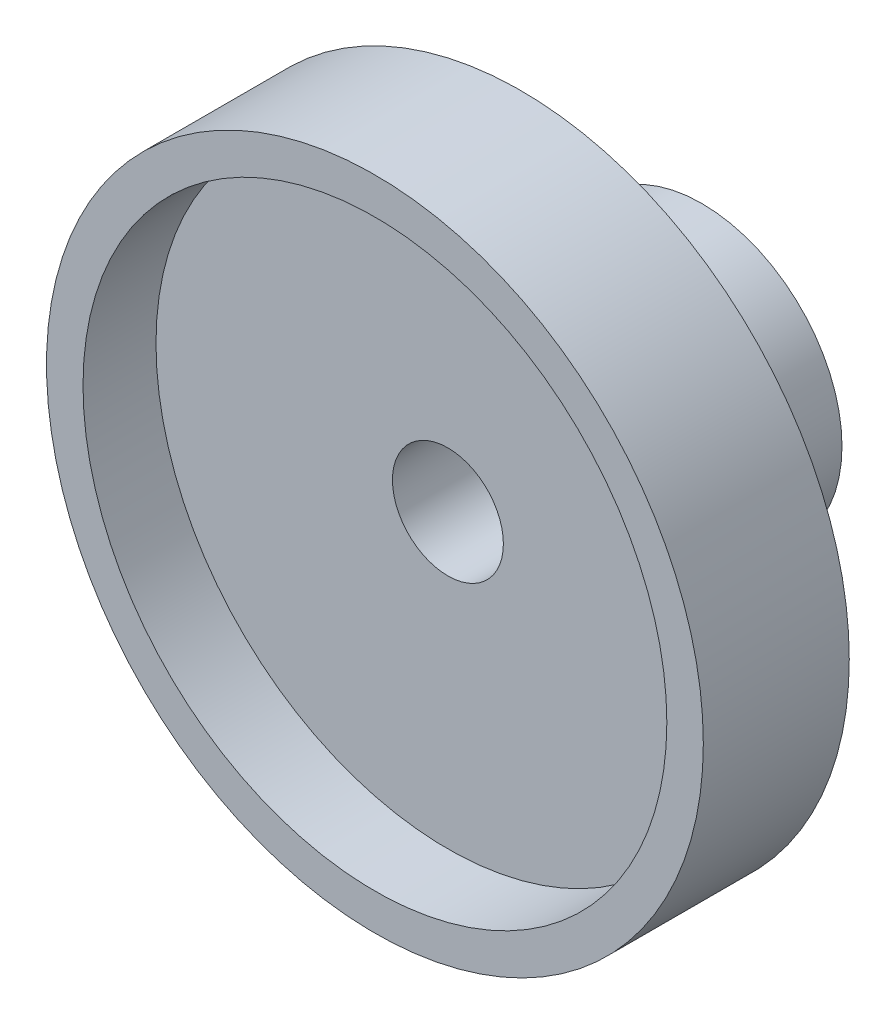
ISO-10303-21;
HEADER;
FILE_DESCRIPTION(('STEP AP214'),'2;1');
FILE_NAME('part.step','',(''),(''),'','','');
FILE_SCHEMA(('AUTOMOTIVE_DESIGN { 1 0 10303 214 1 1 1 1 }'));
ENDSEC;
DATA;
#1=APPLICATION_CONTEXT('core data for automotive mechanical design processes');
#2=APPLICATION_PROTOCOL_DEFINITION('international standard','automotive_design',2000,#1);
#3=PRODUCT_CONTEXT('',#1,'mechanical');
#4=PRODUCT('Part','Part','',(#3));
#5=PRODUCT_RELATED_PRODUCT_CATEGORY('part','',(#4));
#6=PRODUCT_DEFINITION_FORMATION('','',#4);
#7=PRODUCT_DEFINITION_CONTEXT('part definition',#1,'design');
#8=PRODUCT_DEFINITION('design','',#6,#7);
#9=PRODUCT_DEFINITION_SHAPE('','',#8);
#10=(LENGTH_UNIT() NAMED_UNIT(*) SI_UNIT(.MILLI.,.METRE.));
#11=(NAMED_UNIT(*) PLANE_ANGLE_UNIT() SI_UNIT($,.RADIAN.));
#12=(NAMED_UNIT(*) SI_UNIT($,.STERADIAN.) SOLID_ANGLE_UNIT());
#13=UNCERTAINTY_MEASURE_WITH_UNIT(LENGTH_MEASURE(1.E-05),#10,'distance_accuracy_value','');
#14=(GEOMETRIC_REPRESENTATION_CONTEXT(3) GLOBAL_UNCERTAINTY_ASSIGNED_CONTEXT((#13)) GLOBAL_UNIT_ASSIGNED_CONTEXT((#10,
#11,#12)) REPRESENTATION_CONTEXT('',''));
#15=CARTESIAN_POINT('',(0.,0.,0.));
#16=DIRECTION('',(0.,0.,1.));
#17=DIRECTION('',(1.,0.,0.));
#18=AXIS2_PLACEMENT_3D('',#15,#16,#17);
#19=CARTESIAN_POINT('',(0.,0.,6.35));
#20=DIRECTION('',(0.,0.,-1.));
#21=DIRECTION('',(-1.,0.,0.));
#22=AXIS2_PLACEMENT_3D('',#19,#20,#21);
#23=CYLINDRICAL_SURFACE('',#22,14.2875);
#24=CARTESIAN_POINT('',(0.,0.,6.35));
#25=DIRECTION('',(0.,0.,1.));
#26=DIRECTION('',(1.,0.,0.));
#27=AXIS2_PLACEMENT_3D('',#24,#25,#26);
#28=CIRCLE('',#27,14.2875);
#29=CARTESIAN_POINT('',(14.2875,0.,6.35));
#30=VERTEX_POINT('',#29);
#31=EDGE_CURVE('E51',#30,#30,#28,.T.);
#32=ORIENTED_EDGE('',*,*,#31,.F.);
#33=EDGE_LOOP('',(#32));
#34=FACE_BOUND('',#33,.T.);
#35=CARTESIAN_POINT('',(0.,0.,0.));
#36=DIRECTION('',(0.,0.,1.));
#37=DIRECTION('',(1.,0.,0.));
#38=AXIS2_PLACEMENT_3D('',#35,#36,#37);
#39=CIRCLE('',#38,14.2875);
#40=CARTESIAN_POINT('',(14.2875,0.,0.));
#41=VERTEX_POINT('',#40);
#42=EDGE_CURVE('E46',#41,#41,#39,.T.);
#43=ORIENTED_EDGE('',*,*,#42,.T.);
#44=EDGE_LOOP('',(#43));
#45=FACE_BOUND('',#44,.T.);
#46=ADVANCED_FACE('F43',(#34,#45),#23,.T.);
#47=CARTESIAN_POINT('',(0.,0.,6.35));
#48=DIRECTION('',(0.,0.,1.));
#49=DIRECTION('',(1.,0.,0.));
#50=AXIS2_PLACEMENT_3D('',#47,#48,#49);
#51=PLANE('',#50);
#52=CARTESIAN_POINT('',(0.,0.,6.35));
#53=DIRECTION('',(0.,0.,1.));
#54=DIRECTION('',(1.,0.,0.));
#55=AXIS2_PLACEMENT_3D('',#52,#53,#54);
#56=CIRCLE('',#55,12.7);
#57=CARTESIAN_POINT('',(12.7,0.,6.35));
#58=VERTEX_POINT('',#57);
#59=EDGE_CURVE('E65',#58,#58,#56,.T.);
#60=ORIENTED_EDGE('',*,*,#59,.F.);
#61=EDGE_LOOP('',(#60));
#62=FACE_BOUND('',#61,.T.);
#63=ORIENTED_EDGE('',*,*,#31,.T.);
#64=EDGE_LOOP('',(#63));
#65=FACE_BOUND('',#64,.T.);
#66=ADVANCED_FACE('F102',(#62,#65),#51,.T.);
#67=CARTESIAN_POINT('',(0.,0.,0.));
#68=DIRECTION('',(0.,0.,1.));
#69=DIRECTION('',(1.,0.,0.));
#70=AXIS2_PLACEMENT_3D('',#67,#68,#69);
#71=PLANE('',#70);
#72=CARTESIAN_POINT('',(0.,0.,0.));
#73=DIRECTION('',(0.,0.,-1.));
#74=DIRECTION('',(-1.,0.,0.));
#75=AXIS2_PLACEMENT_3D('',#72,#73,#74);
#76=CIRCLE('',#75,6.096);
#77=CARTESIAN_POINT('',(-6.096,0.,0.));
#78=VERTEX_POINT('',#77);
#79=EDGE_CURVE('E10',#78,#78,#76,.T.);
#80=ORIENTED_EDGE('',*,*,#79,.F.);
#81=EDGE_LOOP('',(#80));
#82=FACE_BOUND('',#81,.T.);
#83=ORIENTED_EDGE('',*,*,#42,.F.);
#84=EDGE_LOOP('',(#83));
#85=FACE_BOUND('',#84,.T.);
#86=ADVANCED_FACE('F107',(#82,#85),#71,.F.);
#87=CARTESIAN_POINT('',(0.,0.,3.175));
#88=DIRECTION('',(0.,0.,1.));
#89=DIRECTION('',(1.,0.,0.));
#90=AXIS2_PLACEMENT_3D('',#87,#88,#89);
#91=CYLINDRICAL_SURFACE('',#90,12.7);
#92=CARTESIAN_POINT('',(0.,0.,3.175));
#93=DIRECTION('',(0.,0.,1.));
#94=DIRECTION('',(1.,0.,0.));
#95=AXIS2_PLACEMENT_3D('',#92,#93,#94);
#96=CIRCLE('',#95,12.7);
#97=CARTESIAN_POINT('',(12.7,0.,3.175));
#98=VERTEX_POINT('',#97);
#99=EDGE_CURVE('E61',#98,#98,#96,.T.);
#100=ORIENTED_EDGE('',*,*,#99,.F.);
#101=EDGE_LOOP('',(#100));
#102=FACE_BOUND('',#101,.T.);
#103=ORIENTED_EDGE('',*,*,#59,.T.);
#104=EDGE_LOOP('',(#103));
#105=FACE_BOUND('',#104,.T.);
#106=ADVANCED_FACE('F117',(#102,#105),#91,.F.);
#107=CARTESIAN_POINT('',(0.,0.,3.175));
#108=DIRECTION('',(0.,0.,1.));
#109=DIRECTION('',(1.,0.,0.));
#110=AXIS2_PLACEMENT_3D('',#107,#108,#109);
#111=PLANE('',#110);
#112=CARTESIAN_POINT('',(0.,0.,3.175));
#113=DIRECTION('',(0.,0.,1.));
#114=DIRECTION('',(1.,0.,0.));
#115=AXIS2_PLACEMENT_3D('',#112,#113,#114);
#116=CIRCLE('',#115,2.413);
#117=CARTESIAN_POINT('',(2.413,0.,3.175));
#118=VERTEX_POINT('',#117);
#119=EDGE_CURVE('E72',#118,#118,#116,.F.);
#120=ORIENTED_EDGE('',*,*,#119,.T.);
#121=EDGE_LOOP('',(#120));
#122=FACE_BOUND('',#121,.T.);
#123=ORIENTED_EDGE('',*,*,#99,.T.);
#124=EDGE_LOOP('',(#123));
#125=FACE_BOUND('',#124,.T.);
#126=ADVANCED_FACE('F98',(#122,#125),#111,.T.);
#127=CARTESIAN_POINT('',(0.,0.,-7.874));
#128=DIRECTION('',(0.,0.,1.));
#129=DIRECTION('',(1.,0.,0.));
#130=AXIS2_PLACEMENT_3D('',#127,#128,#129);
#131=CYLINDRICAL_SURFACE('',#130,6.096);
#132=CARTESIAN_POINT('',(0.,0.,-7.874));
#133=DIRECTION('',(0.,0.,-1.));
#134=DIRECTION('',(-1.,0.,0.));
#135=AXIS2_PLACEMENT_3D('',#132,#133,#134);
#136=CIRCLE('',#135,6.096);
#137=CARTESIAN_POINT('',(-6.096,0.,-7.874));
#138=VERTEX_POINT('',#137);
#139=EDGE_CURVE('E59',#138,#138,#136,.T.);
#140=ORIENTED_EDGE('',*,*,#139,.F.);
#141=EDGE_LOOP('',(#140));
#142=FACE_BOUND('',#141,.T.);
#143=ORIENTED_EDGE('',*,*,#79,.T.);
#144=EDGE_LOOP('',(#143));
#145=FACE_BOUND('',#144,.T.);
#146=ADVANCED_FACE('F90',(#142,#145),#131,.T.);
#147=CARTESIAN_POINT('',(0.,0.,-7.874));
#148=DIRECTION('',(0.,0.,-1.));
#149=DIRECTION('',(-1.,0.,0.));
#150=AXIS2_PLACEMENT_3D('',#147,#148,#149);
#151=PLANE('',#150);
#152=CARTESIAN_POINT('',(0.,0.,-7.874));
#153=DIRECTION('',(0.,0.,-1.));
#154=DIRECTION('',(-1.,0.,0.));
#155=AXIS2_PLACEMENT_3D('',#152,#153,#154);
#156=CIRCLE('',#155,2.413);
#157=CARTESIAN_POINT('',(-2.413,0.,-7.874));
#158=VERTEX_POINT('',#157);
#159=EDGE_CURVE('E77',#158,#158,#156,.T.);
#160=ORIENTED_EDGE('',*,*,#159,.F.);
#161=EDGE_LOOP('',(#160));
#162=FACE_BOUND('',#161,.T.);
#163=ORIENTED_EDGE('',*,*,#139,.T.);
#164=EDGE_LOOP('',(#163));
#165=FACE_BOUND('',#164,.T.);
#166=ADVANCED_FACE('F88',(#162,#165),#151,.T.);
#167=CARTESIAN_POINT('',(0.,0.,9.99999465201256));
#168=DIRECTION('',(0.,0.,-1.));
#169=DIRECTION('',(-1.,0.,0.));
#170=AXIS2_PLACEMENT_3D('',#167,#168,#169);
#171=CYLINDRICAL_SURFACE('',#170,2.413);
#172=ORIENTED_EDGE('',*,*,#159,.T.);
#173=EDGE_LOOP('',(#172));
#174=FACE_BOUND('',#173,.T.);
#175=ORIENTED_EDGE('',*,*,#119,.F.);
#176=EDGE_LOOP('',(#175));
#177=FACE_BOUND('',#176,.T.);
#178=ADVANCED_FACE('F85',(#174,#177),#171,.F.);
#179=CLOSED_SHELL('',(#46,#66,#86,#106,#126,#146,#166,#178));
#180=MANIFOLD_SOLID_BREP('B2',#179);
#181=ADVANCED_BREP_SHAPE_REPRESENTATION('',(#18,#180),#14);
#182=SHAPE_DEFINITION_REPRESENTATION(#9,#181);
ENDSEC;
END-ISO-10303-21;
